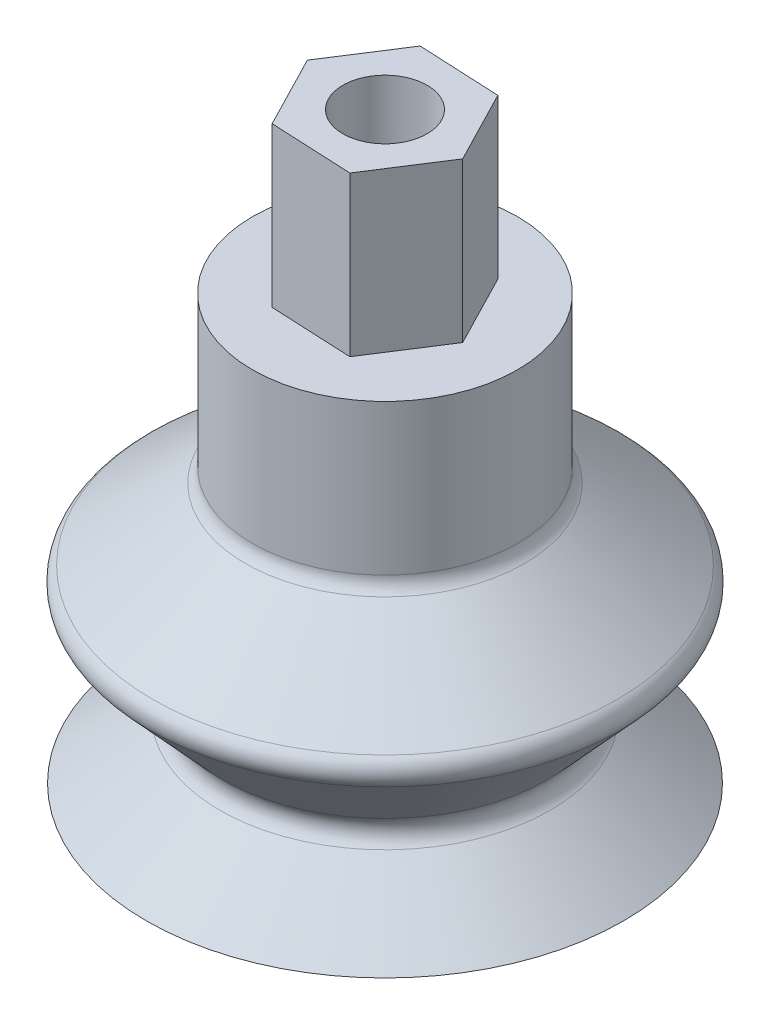
ISO-10303-21;
HEADER;
FILE_DESCRIPTION(('STEP AP214'),'2;1');
FILE_NAME('part.step','',(''),(''),'','','');
FILE_SCHEMA(('AUTOMOTIVE_DESIGN { 1 0 10303 214 1 1 1 1 }'));
ENDSEC;
DATA;
#1=APPLICATION_CONTEXT('core data for automotive mechanical design processes');
#2=APPLICATION_PROTOCOL_DEFINITION('international standard','automotive_design',2000,#1);
#3=PRODUCT_CONTEXT('',#1,'mechanical');
#4=PRODUCT('Part','Part','',(#3));
#5=PRODUCT_RELATED_PRODUCT_CATEGORY('part','',(#4));
#6=PRODUCT_DEFINITION_FORMATION('','',#4);
#7=PRODUCT_DEFINITION_CONTEXT('part definition',#1,'design');
#8=PRODUCT_DEFINITION('design','',#6,#7);
#9=PRODUCT_DEFINITION_SHAPE('','',#8);
#10=(LENGTH_UNIT() NAMED_UNIT(*) SI_UNIT(.MILLI.,.METRE.));
#11=(NAMED_UNIT(*) PLANE_ANGLE_UNIT() SI_UNIT($,.RADIAN.));
#12=(NAMED_UNIT(*) SI_UNIT($,.STERADIAN.) SOLID_ANGLE_UNIT());
#13=UNCERTAINTY_MEASURE_WITH_UNIT(LENGTH_MEASURE(1.E-05),#10,'distance_accuracy_value','');
#14=(GEOMETRIC_REPRESENTATION_CONTEXT(3) GLOBAL_UNCERTAINTY_ASSIGNED_CONTEXT((#13)) GLOBAL_UNIT_ASSIGNED_CONTEXT((#10,
#11,#12)) REPRESENTATION_CONTEXT('',''));
#15=CARTESIAN_POINT('',(0.,0.,0.));
#16=DIRECTION('',(0.,0.,1.));
#17=DIRECTION('',(1.,0.,0.));
#18=AXIS2_PLACEMENT_3D('',#15,#16,#17);
#19=CARTESIAN_POINT('',(7.77363184079602,24.8756218905473,0.));
#20=DIRECTION('',(0.,-1.,0.));
#21=DIRECTION('',(1.,0.,0.));
#22=AXIS2_PLACEMENT_3D('',#19,#20,#21);
#23=PLANE('',#22);
#24=CARTESIAN_POINT('',(0.,24.8756218905473,0.));
#25=DIRECTION('',(0.,1.,0.));
#26=DIRECTION('',(-1.,0.,0.));
#27=AXIS2_PLACEMENT_3D('',#24,#25,#26);
#28=CIRCLE('',#27,7.77363184079602);
#29=CARTESIAN_POINT('',(-7.77363184079602,24.8756218905473,0.));
#30=VERTEX_POINT('',#29);
#31=EDGE_CURVE('E153',#30,#30,#28,.T.);
#32=ORIENTED_EDGE('',*,*,#31,.T.);
#33=EDGE_LOOP('',(#32));
#34=FACE_BOUND('',#33,.T.);
#35=DIRECTION('',(-0.458306437489919,0.,-0.88879424466819));
#36=VECTOR('',#35,1.);
#37=CARTESIAN_POINT('',(4.78191372190851,24.8756218905473,0.227359697029234));
#38=LINE('',#37,#36);
#39=CARTESIAN_POINT('',(4.78191372190851,24.8756218905473,0.227359697029234));
#40=VERTEX_POINT('',#39);
#41=CARTESIAN_POINT('',(2.5878561343783,24.8756218905473,-4.02757891336355));
#42=VERTEX_POINT('',#41);
#43=EDGE_CURVE('E65',#40,#42,#38,.T.);
#44=ORIENTED_EDGE('',*,*,#43,.F.);
#45=DIRECTION('',(0.540565175875095,0.,-0.84130213991831));
#46=VECTOR('',#45,1.);
#47=CARTESIAN_POINT('',(2.19405758753021,24.8756218905473,4.25493861039279));
#48=LINE('',#47,#46);
#49=CARTESIAN_POINT('',(2.19405758753021,24.8756218905473,4.25493861039279));
#50=VERTEX_POINT('',#49);
#51=EDGE_CURVE('E69',#50,#40,#48,.T.);
#52=ORIENTED_EDGE('',*,*,#51,.F.);
#53=DIRECTION('',(0.998871613365014,0.,0.0474921047498808));
#54=VECTOR('',#53,1.);
#55=CARTESIAN_POINT('',(-2.5878561343783,24.8756218905473,4.02757891336355));
#56=LINE('',#55,#54);
#57=CARTESIAN_POINT('',(-2.5878561343783,24.8756218905473,4.02757891336355));
#58=VERTEX_POINT('',#57);
#59=EDGE_CURVE('E300',#58,#50,#56,.T.);
#60=ORIENTED_EDGE('',*,*,#59,.F.);
#61=DIRECTION('',(0.458306437489919,0.,0.88879424466819));
#62=VECTOR('',#61,1.);
#63=CARTESIAN_POINT('',(-4.78191372190851,24.8756218905473,-0.227359697029234));
#64=LINE('',#63,#62);
#65=CARTESIAN_POINT('',(-4.78191372190851,24.8756218905473,-0.227359697029234));
#66=VERTEX_POINT('',#65);
#67=EDGE_CURVE('E296',#66,#58,#64,.T.);
#68=ORIENTED_EDGE('',*,*,#67,.F.);
#69=DIRECTION('',(-0.540565175875095,0.,0.84130213991831));
#70=VECTOR('',#69,1.);
#71=CARTESIAN_POINT('',(-2.19405758753021,24.8756218905473,-4.25493861039279));
#72=LINE('',#71,#70);
#73=CARTESIAN_POINT('',(-2.19405758753021,24.8756218905473,-4.25493861039279));
#74=VERTEX_POINT('',#73);
#75=EDGE_CURVE('E292',#74,#66,#72,.T.);
#76=ORIENTED_EDGE('',*,*,#75,.F.);
#77=DIRECTION('',(-0.998871613365014,0.,-0.0474921047498808));
#78=VECTOR('',#77,1.);
#79=CARTESIAN_POINT('',(2.5878561343783,24.8756218905473,-4.02757891336355));
#80=LINE('',#79,#78);
#81=EDGE_CURVE('E289',#42,#74,#80,.T.);
#82=ORIENTED_EDGE('',*,*,#81,.F.);
#83=EDGE_LOOP('',(#44,#52,#60,#68,#76,#82));
#84=FACE_BOUND('',#83,.T.);
#85=ADVANCED_FACE('F49',(#34,#84),#23,.F.);
#86=CARTESIAN_POINT('',(0.,0.,0.));
#87=DIRECTION('',(0.,1.,0.));
#88=DIRECTION('',(-1.,0.,0.));
#89=AXIS2_PLACEMENT_3D('',#86,#87,#88);
#90=PLANE('',#89);
#91=CARTESIAN_POINT('',(0.,0.,0.));
#92=DIRECTION('',(0.,1.,0.));
#93=DIRECTION('',(-1.,0.,0.));
#94=AXIS2_PLACEMENT_3D('',#91,#92,#93);
#95=CIRCLE('',#94,12.4992713998524);
#96=CARTESIAN_POINT('',(-12.4992713998524,0.,0.));
#97=VERTEX_POINT('',#96);
#98=EDGE_CURVE('E142',#97,#97,#95,.T.);
#99=ORIENTED_EDGE('',*,*,#98,.T.);
#100=EDGE_LOOP('',(#99));
#101=FACE_BOUND('',#100,.T.);
#102=CARTESIAN_POINT('',(0.,0.,0.));
#103=DIRECTION('',(0.,1.,0.));
#104=DIRECTION('',(-1.,0.,0.));
#105=AXIS2_PLACEMENT_3D('',#102,#103,#104);
#106=CIRCLE('',#105,13.9925373134328);
#107=CARTESIAN_POINT('',(-13.9925373134328,0.,0.));
#108=VERTEX_POINT('',#107);
#109=EDGE_CURVE('E157',#108,#108,#106,.T.);
#110=ORIENTED_EDGE('',*,*,#109,.F.);
#111=EDGE_LOOP('',(#110));
#112=FACE_BOUND('',#111,.T.);
#113=ADVANCED_FACE('F205',(#101,#112),#90,.F.);
#114=CARTESIAN_POINT('',(0.,0.,0.));
#115=DIRECTION('',(0.,-1.,0.));
#116=DIRECTION('',(1.,0.,0.));
#117=AXIS2_PLACEMENT_3D('',#114,#115,#116);
#118=CONICAL_SURFACE('',#117,13.9925373134328,0.896055384571344);
#119=CARTESIAN_POINT('',(0.,3.45340457451046,0.));
#120=DIRECTION('',(0.,-1.,0.));
#121=DIRECTION('',(1.,0.,0.));
#122=AXIS2_PLACEMENT_3D('',#119,#120,#121);
#123=CIRCLE('',#122,9.67578159529476);
#124=CARTESIAN_POINT('',(9.67578159529476,3.45340457451046,0.));
#125=VERTEX_POINT('',#124);
#126=EDGE_CURVE('E11',#125,#125,#123,.T.);
#127=ORIENTED_EDGE('',*,*,#126,.T.);
#128=EDGE_LOOP('',(#127));
#129=FACE_BOUND('',#128,.T.);
#130=ORIENTED_EDGE('',*,*,#109,.T.);
#131=EDGE_LOOP('',(#130));
#132=FACE_BOUND('',#131,.T.);
#133=ADVANCED_FACE('F202',(#129,#132),#118,.T.);
#134=CARTESIAN_POINT('',(0.,4.14593698175788,0.));
#135=DIRECTION('',(0.,1.,0.));
#136=DIRECTION('',(-1.,0.,0.));
#137=AXIS2_PLACEMENT_3D('',#134,#135,#136);
#138=CONICAL_SURFACE('',#137,8.81011608623549,0.741947268005917);
#139=CARTESIAN_POINT('',(0.,9.5318785971969,0.));
#140=DIRECTION('',(0.,-1.,0.));
#141=DIRECTION('',(1.,0.,0.));
#142=AXIS2_PLACEMENT_3D('',#139,#140,#141);
#143=CIRCLE('',#142,13.7472292337213);
#144=CARTESIAN_POINT('',(13.7472292337213,9.5318785971969,0.));
#145=VERTEX_POINT('',#144);
#146=EDGE_CURVE('E58',#145,#145,#143,.T.);
#147=ORIENTED_EDGE('',*,*,#146,.T.);
#148=EDGE_LOOP('',(#147));
#149=FACE_BOUND('',#148,.T.);
#150=CARTESIAN_POINT('',(0.,4.96314072496691,0.));
#151=DIRECTION('',(0.,1.,0.));
#152=DIRECTION('',(-1.,0.,0.));
#153=AXIS2_PLACEMENT_3D('',#150,#151,#152);
#154=CIRCLE('',#153,9.55921951751044);
#155=CARTESIAN_POINT('',(-9.55921951751044,4.9631407249669,0.));
#156=VERTEX_POINT('',#155);
#157=EDGE_CURVE('E173',#156,#156,#154,.T.);
#158=ORIENTED_EDGE('',*,*,#157,.T.);
#159=EDGE_LOOP('',(#158));
#160=FACE_BOUND('',#159,.T.);
#161=ADVANCED_FACE('F181',(#149,#160),#138,.T.);
#162=CARTESIAN_POINT('',(0.,10.3648424543947,0.));
#163=DIRECTION('',(0.,-1.,0.));
#164=DIRECTION('',(1.,0.,0.));
#165=AXIS2_PLACEMENT_3D('',#162,#163,#164);
#166=CONICAL_SURFACE('',#165,14.5107794361526,0.91510070055336);
#167=CARTESIAN_POINT('',(0.,15.236087798866,0.));
#168=DIRECTION('',(0.,-1.,0.));
#169=DIRECTION('',(1.,0.,0.));
#170=AXIS2_PLACEMENT_3D('',#167,#168,#169);
#171=CIRCLE('',#170,8.17816048833986);
#172=CARTESIAN_POINT('',(8.17816048833986,15.236087798866,0.));
#173=VERTEX_POINT('',#172);
#174=EDGE_CURVE('E169',#173,#173,#171,.T.);
#175=ORIENTED_EDGE('',*,*,#174,.T.);
#176=EDGE_LOOP('',(#175));
#177=FACE_BOUND('',#176,.T.);
#178=CARTESIAN_POINT('',(0.,11.0537988061749,0.));
#179=DIRECTION('',(0.,1.,0.));
#180=DIRECTION('',(-1.,0.,0.));
#181=AXIS2_PLACEMENT_3D('',#178,#179,#180);
#182=CIRCLE('',#181,13.6151361788383);
#183=CARTESIAN_POINT('',(-13.6151361788383,11.0537988061749,0.));
#184=VERTEX_POINT('',#183);
#185=EDGE_CURVE('E165',#184,#184,#182,.T.);
#186=ORIENTED_EDGE('',*,*,#185,.T.);
#187=EDGE_LOOP('',(#186));
#188=FACE_BOUND('',#187,.T.);
#189=ADVANCED_FACE('F190',(#177,#188),#166,.T.);
#190=CARTESIAN_POINT('',(0.,24.8756218905473,0.));
#191=DIRECTION('',(0.,1.,0.));
#192=DIRECTION('',(-1.,0.,0.));
#193=AXIS2_PLACEMENT_3D('',#190,#191,#192);
#194=CYLINDRICAL_SURFACE('',#193,7.77363184079602);
#195=CARTESIAN_POINT('',(0.,16.0576300761303,0.));
#196=DIRECTION('',(0.,1.,0.));
#197=DIRECTION('',(-1.,0.,0.));
#198=AXIS2_PLACEMENT_3D('',#195,#196,#197);
#199=CIRCLE('',#198,7.77363184079602);
#200=CARTESIAN_POINT('',(-7.77363184079602,16.0576300761303,0.));
#201=VERTEX_POINT('',#200);
#202=EDGE_CURVE('E161',#201,#201,#199,.T.);
#203=ORIENTED_EDGE('',*,*,#202,.T.);
#204=EDGE_LOOP('',(#203));
#205=FACE_BOUND('',#204,.T.);
#206=ORIENTED_EDGE('',*,*,#31,.F.);
#207=EDGE_LOOP('',(#206));
#208=FACE_BOUND('',#207,.T.);
#209=ADVANCED_FACE('F192',(#205,#208),#194,.T.);
#210=CARTESIAN_POINT('',(0.,-0.728422396868498,0.));
#211=DIRECTION('',(0.,-1.,0.));
#212=DIRECTION('',(1.,0.,0.));
#213=AXIS2_PLACEMENT_3D('',#210,#211,#212);
#214=CONICAL_SURFACE('',#213,13.409799395938,0.896055384571344);
#215=CARTESIAN_POINT('',(0.,4.04079375141205,0.));
#216=DIRECTION('',(0.,1.,0.));
#217=DIRECTION('',(-1.,0.,0.));
#218=AXIS2_PLACEMENT_3D('',#215,#216,#217);
#219=CIRCLE('',#218,7.44827921058735);
#220=CARTESIAN_POINT('',(-7.44827921058735,4.04079375141205,0.));
#221=VERTEX_POINT('',#220);
#222=EDGE_CURVE('E138',#221,#221,#219,.T.);
#223=ORIENTED_EDGE('',*,*,#222,.T.);
#224=EDGE_LOOP('',(#223));
#225=FACE_BOUND('',#224,.T.);
#226=ORIENTED_EDGE('',*,*,#98,.F.);
#227=EDGE_LOOP('',(#226));
#228=FACE_BOUND('',#227,.T.);
#229=ADVANCED_FACE('F199',(#225,#228),#214,.F.);
#230=CARTESIAN_POINT('',(0.,4.77627712030018,0.));
#231=DIRECTION('',(0.,1.,0.));
#232=DIRECTION('',(-1.,0.,0.));
#233=AXIS2_PLACEMENT_3D('',#230,#231,#232);
#234=CONICAL_SURFACE('',#233,8.1224722987348,0.741947268005917);
#235=CARTESIAN_POINT('',(0.,10.245515121459,0.));
#236=DIRECTION('',(0.,1.,0.));
#237=DIRECTION('',(-1.,0.,0.));
#238=AXIS2_PLACEMENT_3D('',#235,#236,#237);
#239=CIRCLE('',#238,13.1359404664637);
#240=CARTESIAN_POINT('',(-13.1359404664637,10.245515121459,0.));
#241=VERTEX_POINT('',#240);
#242=EDGE_CURVE('E143',#241,#241,#239,.T.);
#243=ORIENTED_EDGE('',*,*,#242,.T.);
#244=EDGE_LOOP('',(#243));
#245=FACE_BOUND('',#244,.T.);
#246=ORIENTED_EDGE('',*,*,#222,.F.);
#247=EDGE_LOOP('',(#246));
#248=FACE_BOUND('',#247,.T.);
#249=ADVANCED_FACE('F225',(#245,#248),#234,.F.);
#250=CARTESIAN_POINT('',(0.,9.62545440485682,0.));
#251=DIRECTION('',(0.,-1.,0.));
#252=DIRECTION('',(1.,0.,0.));
#253=AXIS2_PLACEMENT_3D('',#250,#251,#252);
#254=CONICAL_SURFACE('',#253,13.9420193980465,0.91510070055336);
#255=CARTESIAN_POINT('',(0.,15.0879339265076,0.));
#256=DIRECTION('',(0.,-1.,0.));
#257=DIRECTION('',(1.,0.,0.));
#258=AXIS2_PLACEMENT_3D('',#255,#256,#257);
#259=CIRCLE('',#258,6.8407960199005);
#260=CARTESIAN_POINT('',(6.8407960199005,15.0879339265076,0.));
#261=VERTEX_POINT('',#260);
#262=EDGE_CURVE('E132',#261,#261,#259,.F.);
#263=ORIENTED_EDGE('',*,*,#262,.T.);
#264=EDGE_LOOP('',(#263));
#265=FACE_BOUND('',#264,.T.);
#266=ORIENTED_EDGE('',*,*,#242,.F.);
#267=EDGE_LOOP('',(#266));
#268=FACE_BOUND('',#267,.T.);
#269=ADVANCED_FACE('F221',(#265,#268),#254,.F.);
#270=CARTESIAN_POINT('',(0.,24.8756218905473,0.));
#271=DIRECTION('',(0.,1.,0.));
#272=DIRECTION('',(-1.,0.,0.));
#273=AXIS2_PLACEMENT_3D('',#270,#271,#272);
#274=CYLINDRICAL_SURFACE('',#273,6.8407960199005);
#275=CARTESIAN_POINT('',(0.,23.9427860696517,0.));
#276=DIRECTION('',(0.,-1.,0.));
#277=DIRECTION('',(1.,0.,0.));
#278=AXIS2_PLACEMENT_3D('',#275,#276,#277);
#279=CIRCLE('',#278,6.8407960199005);
#280=CARTESIAN_POINT('',(6.8407960199005,23.9427860696517,0.));
#281=VERTEX_POINT('',#280);
#282=EDGE_CURVE('E126',#281,#281,#279,.F.);
#283=ORIENTED_EDGE('',*,*,#282,.T.);
#284=EDGE_LOOP('',(#283));
#285=FACE_BOUND('',#284,.T.);
#286=ORIENTED_EDGE('',*,*,#262,.F.);
#287=EDGE_LOOP('',(#286));
#288=FACE_BOUND('',#287,.T.);
#289=ADVANCED_FACE('F217',(#285,#288),#274,.F.);
#290=CARTESIAN_POINT('',(7.77363184079602,23.9427860696517,0.));
#291=DIRECTION('',(0.,-1.,0.));
#292=DIRECTION('',(1.,0.,0.));
#293=AXIS2_PLACEMENT_3D('',#290,#291,#292);
#294=PLANE('',#293);
#295=CARTESIAN_POINT('',(0.,23.9427860696517,0.));
#296=DIRECTION('',(0.,-1.,0.));
#297=DIRECTION('',(1.,0.,0.));
#298=AXIS2_PLACEMENT_3D('',#295,#296,#297);
#299=CIRCLE('',#298,2.46812810945274);
#300=CARTESIAN_POINT('',(2.46812810945274,23.9427860696517,0.));
#301=VERTEX_POINT('',#300);
#302=EDGE_CURVE('E266',#301,#301,#299,.T.);
#303=ORIENTED_EDGE('',*,*,#302,.F.);
#304=EDGE_LOOP('',(#303));
#305=FACE_BOUND('',#304,.T.);
#306=ORIENTED_EDGE('',*,*,#282,.F.);
#307=EDGE_LOOP('',(#306));
#308=FACE_BOUND('',#307,.T.);
#309=ADVANCED_FACE('F214',(#305,#308),#294,.T.);
#310=CARTESIAN_POINT('',(4.78191372190851,34.2039800995025,0.227359697029234));
#311=DIRECTION('',(-0.88879424466819,0.,0.458306437489919));
#312=DIRECTION('',(0.458306437489919,0.,0.888794244668191));
#313=AXIS2_PLACEMENT_3D('',#310,#311,#312);
#314=PLANE('',#313);
#315=ORIENTED_EDGE('',*,*,#43,.T.);
#316=DIRECTION('',(0.,-1.,0.));
#317=VECTOR('',#316,1.);
#318=CARTESIAN_POINT('',(2.5878561343783,34.2039800995025,-4.02757891336355));
#319=LINE('',#318,#317);
#320=CARTESIAN_POINT('',(2.5878561343783,34.2039800995025,-4.02757891336355));
#321=VERTEX_POINT('',#320);
#322=EDGE_CURVE('E106',#321,#42,#319,.T.);
#323=ORIENTED_EDGE('',*,*,#322,.F.);
#324=DIRECTION('',(-0.458306437489919,0.,-0.88879424466819));
#325=VECTOR('',#324,1.);
#326=CARTESIAN_POINT('',(4.78191372190851,34.2039800995025,0.227359697029234));
#327=LINE('',#326,#325);
#328=CARTESIAN_POINT('',(4.78191372190851,34.2039800995025,0.227359697029234));
#329=VERTEX_POINT('',#328);
#330=EDGE_CURVE('E113',#329,#321,#327,.T.);
#331=ORIENTED_EDGE('',*,*,#330,.F.);
#332=DIRECTION('',(0.,-1.,0.));
#333=VECTOR('',#332,1.);
#334=CARTESIAN_POINT('',(4.78191372190851,34.2039800995025,0.227359697029234));
#335=LINE('',#334,#333);
#336=EDGE_CURVE('E286',#329,#40,#335,.T.);
#337=ORIENTED_EDGE('',*,*,#336,.T.);
#338=EDGE_LOOP('',(#315,#323,#331,#337));
#339=FACE_BOUND('',#338,.T.);
#340=ADVANCED_FACE('F124',(#339),#314,.F.);
#341=CARTESIAN_POINT('',(2.5878561343783,34.2039800995025,-4.02757891336355));
#342=DIRECTION('',(-0.0474921047498808,0.,0.998871613365014));
#343=DIRECTION('',(0.998871613365014,0.,0.0474921047498808));
#344=AXIS2_PLACEMENT_3D('',#341,#342,#343);
#345=PLANE('',#344);
#346=ORIENTED_EDGE('',*,*,#81,.T.);
#347=DIRECTION('',(0.,-1.,0.));
#348=VECTOR('',#347,1.);
#349=CARTESIAN_POINT('',(-2.19405758753021,34.2039800995025,-4.25493861039279));
#350=LINE('',#349,#348);
#351=CARTESIAN_POINT('',(-2.19405758753021,34.2039800995025,-4.25493861039279));
#352=VERTEX_POINT('',#351);
#353=EDGE_CURVE('E108',#352,#74,#350,.T.);
#354=ORIENTED_EDGE('',*,*,#353,.F.);
#355=DIRECTION('',(-0.998871613365014,0.,-0.0474921047498808));
#356=VECTOR('',#355,1.);
#357=CARTESIAN_POINT('',(2.5878561343783,34.2039800995025,-4.02757891336355));
#358=LINE('',#357,#356);
#359=EDGE_CURVE('E101',#321,#352,#358,.T.);
#360=ORIENTED_EDGE('',*,*,#359,.F.);
#361=ORIENTED_EDGE('',*,*,#322,.T.);
#362=EDGE_LOOP('',(#346,#354,#360,#361));
#363=FACE_BOUND('',#362,.T.);
#364=ADVANCED_FACE('F104',(#363),#345,.F.);
#365=CARTESIAN_POINT('',(-2.19405758753021,34.2039800995025,-4.25493861039279));
#366=DIRECTION('',(0.84130213991831,0.,0.540565175875095));
#367=DIRECTION('',(0.540565175875095,0.,-0.84130213991831));
#368=AXIS2_PLACEMENT_3D('',#365,#366,#367);
#369=PLANE('',#368);
#370=ORIENTED_EDGE('',*,*,#75,.T.);
#371=DIRECTION('',(0.,-1.,0.));
#372=VECTOR('',#371,1.);
#373=CARTESIAN_POINT('',(-4.78191372190851,34.2039800995025,-0.227359697029234));
#374=LINE('',#373,#372);
#375=CARTESIAN_POINT('',(-4.78191372190851,34.2039800995025,-0.227359697029234));
#376=VERTEX_POINT('',#375);
#377=EDGE_CURVE('E134',#376,#66,#374,.T.);
#378=ORIENTED_EDGE('',*,*,#377,.F.);
#379=DIRECTION('',(-0.540565175875095,0.,0.84130213991831));
#380=VECTOR('',#379,1.);
#381=CARTESIAN_POINT('',(-2.19405758753021,34.2039800995025,-4.25493861039279));
#382=LINE('',#381,#380);
#383=EDGE_CURVE('E112',#352,#376,#382,.T.);
#384=ORIENTED_EDGE('',*,*,#383,.F.);
#385=ORIENTED_EDGE('',*,*,#353,.T.);
#386=EDGE_LOOP('',(#370,#378,#384,#385));
#387=FACE_BOUND('',#386,.T.);
#388=ADVANCED_FACE('F237',(#387),#369,.F.);
#389=CARTESIAN_POINT('',(-4.78191372190851,34.2039800995025,-0.227359697029234));
#390=DIRECTION('',(0.88879424466819,0.,-0.458306437489919));
#391=DIRECTION('',(-0.458306437489919,0.,-0.888794244668191));
#392=AXIS2_PLACEMENT_3D('',#389,#390,#391);
#393=PLANE('',#392);
#394=ORIENTED_EDGE('',*,*,#67,.T.);
#395=DIRECTION('',(0.,-1.,0.));
#396=VECTOR('',#395,1.);
#397=CARTESIAN_POINT('',(-2.58785613437831,34.2039800995025,4.02757891336355));
#398=LINE('',#397,#396);
#399=CARTESIAN_POINT('',(-2.58785613437831,34.2039800995025,4.02757891336355));
#400=VERTEX_POINT('',#399);
#401=EDGE_CURVE('E311',#400,#58,#398,.T.);
#402=ORIENTED_EDGE('',*,*,#401,.F.);
#403=DIRECTION('',(0.458306437489919,0.,0.88879424466819));
#404=VECTOR('',#403,1.);
#405=CARTESIAN_POINT('',(-4.78191372190851,34.2039800995025,-0.227359697029234));
#406=LINE('',#405,#404);
#407=EDGE_CURVE('E278',#376,#400,#406,.T.);
#408=ORIENTED_EDGE('',*,*,#407,.F.);
#409=ORIENTED_EDGE('',*,*,#377,.T.);
#410=EDGE_LOOP('',(#394,#402,#408,#409));
#411=FACE_BOUND('',#410,.T.);
#412=ADVANCED_FACE('F240',(#411),#393,.F.);
#413=CARTESIAN_POINT('',(-2.58785613437831,34.2039800995025,4.02757891336355));
#414=DIRECTION('',(0.0474921047498808,0.,-0.998871613365014));
#415=DIRECTION('',(-0.998871613365014,0.,-0.0474921047498808));
#416=AXIS2_PLACEMENT_3D('',#413,#414,#415);
#417=PLANE('',#416);
#418=ORIENTED_EDGE('',*,*,#59,.T.);
#419=DIRECTION('',(0.,-1.,0.));
#420=VECTOR('',#419,1.);
#421=CARTESIAN_POINT('',(2.19405758753021,34.2039800995025,4.25493861039279));
#422=LINE('',#421,#420);
#423=CARTESIAN_POINT('',(2.19405758753021,34.2039800995025,4.25493861039279));
#424=VERTEX_POINT('',#423);
#425=EDGE_CURVE('E307',#424,#50,#422,.T.);
#426=ORIENTED_EDGE('',*,*,#425,.F.);
#427=DIRECTION('',(0.998871613365014,0.,0.0474921047498808));
#428=VECTOR('',#427,1.);
#429=CARTESIAN_POINT('',(-2.58785613437831,34.2039800995025,4.02757891336355));
#430=LINE('',#429,#428);
#431=EDGE_CURVE('E281',#400,#424,#430,.T.);
#432=ORIENTED_EDGE('',*,*,#431,.F.);
#433=ORIENTED_EDGE('',*,*,#401,.T.);
#434=EDGE_LOOP('',(#418,#426,#432,#433));
#435=FACE_BOUND('',#434,.T.);
#436=ADVANCED_FACE('F244',(#435),#417,.F.);
#437=CARTESIAN_POINT('',(2.19405758753021,34.2039800995025,4.25493861039279));
#438=DIRECTION('',(-0.84130213991831,0.,-0.540565175875095));
#439=DIRECTION('',(-0.540565175875095,0.,0.84130213991831));
#440=AXIS2_PLACEMENT_3D('',#437,#438,#439);
#441=PLANE('',#440);
#442=ORIENTED_EDGE('',*,*,#51,.T.);
#443=ORIENTED_EDGE('',*,*,#336,.F.);
#444=DIRECTION('',(0.540565175875095,0.,-0.84130213991831));
#445=VECTOR('',#444,1.);
#446=CARTESIAN_POINT('',(2.19405758753021,34.2039800995025,4.25493861039279));
#447=LINE('',#446,#445);
#448=EDGE_CURVE('E118',#424,#329,#447,.T.);
#449=ORIENTED_EDGE('',*,*,#448,.F.);
#450=ORIENTED_EDGE('',*,*,#425,.T.);
#451=EDGE_LOOP('',(#442,#443,#449,#450));
#452=FACE_BOUND('',#451,.T.);
#453=ADVANCED_FACE('F248',(#452),#441,.F.);
#454=CARTESIAN_POINT('',(0.,34.2039800995025,0.));
#455=DIRECTION('',(0.,1.,0.));
#456=DIRECTION('',(0.,0.,1.));
#457=AXIS2_PLACEMENT_3D('',#454,#455,#456);
#458=PLANE('',#457);
#459=CARTESIAN_POINT('',(0.,34.2039800995025,0.));
#460=DIRECTION('',(0.,1.,0.));
#461=DIRECTION('',(0.,0.,1.));
#462=AXIS2_PLACEMENT_3D('',#459,#460,#461);
#463=CIRCLE('',#462,2.46812810945274);
#464=CARTESIAN_POINT('',(0.,34.2039800995025,2.46812810945274));
#465=VERTEX_POINT('',#464);
#466=EDGE_CURVE('E269',#465,#465,#463,.T.);
#467=ORIENTED_EDGE('',*,*,#466,.F.);
#468=EDGE_LOOP('',(#467));
#469=FACE_BOUND('',#468,.T.);
#470=ORIENTED_EDGE('',*,*,#330,.T.);
#471=ORIENTED_EDGE('',*,*,#359,.T.);
#472=ORIENTED_EDGE('',*,*,#383,.T.);
#473=ORIENTED_EDGE('',*,*,#407,.T.);
#474=ORIENTED_EDGE('',*,*,#431,.T.);
#475=ORIENTED_EDGE('',*,*,#448,.T.);
#476=EDGE_LOOP('',(#470,#471,#472,#473,#474,#475));
#477=FACE_BOUND('',#476,.T.);
#478=ADVANCED_FACE('F116',(#469,#477),#458,.T.);
#479=CARTESIAN_POINT('',(0.,16.0576300761303,0.));
#480=DIRECTION('',(0.,1.,0.));
#481=DIRECTION('',(-1.,0.,0.));
#482=AXIS2_PLACEMENT_3D('',#479,#480,#481);
#483=TOROIDAL_SURFACE('',#482,8.81011608623549,1.03648424543947);
#484=ORIENTED_EDGE('',*,*,#174,.F.);
#485=EDGE_LOOP('',(#484));
#486=FACE_BOUND('',#485,.T.);
#487=ORIENTED_EDGE('',*,*,#202,.F.);
#488=EDGE_LOOP('',(#487));
#489=FACE_BOUND('',#488,.T.);
#490=ADVANCED_FACE('F187',(#486,#489),#483,.F.);
#491=CARTESIAN_POINT('',(0.,10.2322565289106,0.));
#492=DIRECTION('',(0.,-1.,0.));
#493=DIRECTION('',(1.,0.,0.));
#494=AXIS2_PLACEMENT_3D('',#491,#492,#493);
#495=TOROIDAL_SURFACE('',#494,12.9831805809427,1.03648424543947);
#496=ORIENTED_EDGE('',*,*,#146,.F.);
#497=EDGE_LOOP('',(#496));
#498=FACE_BOUND('',#497,.T.);
#499=ORIENTED_EDGE('',*,*,#185,.F.);
#500=EDGE_LOOP('',(#499));
#501=FACE_BOUND('',#500,.T.);
#502=ADVANCED_FACE('F184',(#498,#501),#495,.T.);
#503=CARTESIAN_POINT('',(0.,4.26276279325324,0.));
#504=DIRECTION('',(0.,1.,0.));
#505=DIRECTION('',(-1.,0.,0.));
#506=AXIS2_PLACEMENT_3D('',#503,#504,#505);
#507=TOROIDAL_SURFACE('',#506,10.323268170289,1.03648424543947);
#508=ORIENTED_EDGE('',*,*,#126,.F.);
#509=EDGE_LOOP('',(#508));
#510=FACE_BOUND('',#509,.T.);
#511=ORIENTED_EDGE('',*,*,#157,.F.);
#512=EDGE_LOOP('',(#511));
#513=FACE_BOUND('',#512,.T.);
#514=ADVANCED_FACE('F51',(#510,#513),#507,.F.);
#515=CARTESIAN_POINT('',(0.,0.,0.));
#516=DIRECTION('',(0.,1.,0.));
#517=DIRECTION('',(0.,0.,1.));
#518=AXIS2_PLACEMENT_3D('',#515,#516,#517);
#519=CYLINDRICAL_SURFACE('',#518,2.46812810945274);
#520=ORIENTED_EDGE('',*,*,#302,.T.);
#521=EDGE_LOOP('',(#520));
#522=FACE_BOUND('',#521,.T.);
#523=ORIENTED_EDGE('',*,*,#466,.T.);
#524=EDGE_LOOP('',(#523));
#525=FACE_BOUND('',#524,.T.);
#526=ADVANCED_FACE('F256',(#522,#525),#519,.F.);
#527=CLOSED_SHELL('',(#85,#113,#133,#161,#189,#209,#229,#249,#269,#289,#309,#340,#364,#388,#412,
#436,#453,#478,#490,#502,#514,#526));
#528=MANIFOLD_SOLID_BREP('B2',#527);
#529=ADVANCED_BREP_SHAPE_REPRESENTATION('',(#18,#528),#14);
#530=SHAPE_DEFINITION_REPRESENTATION(#9,#529);
ENDSEC;
END-ISO-10303-21;
